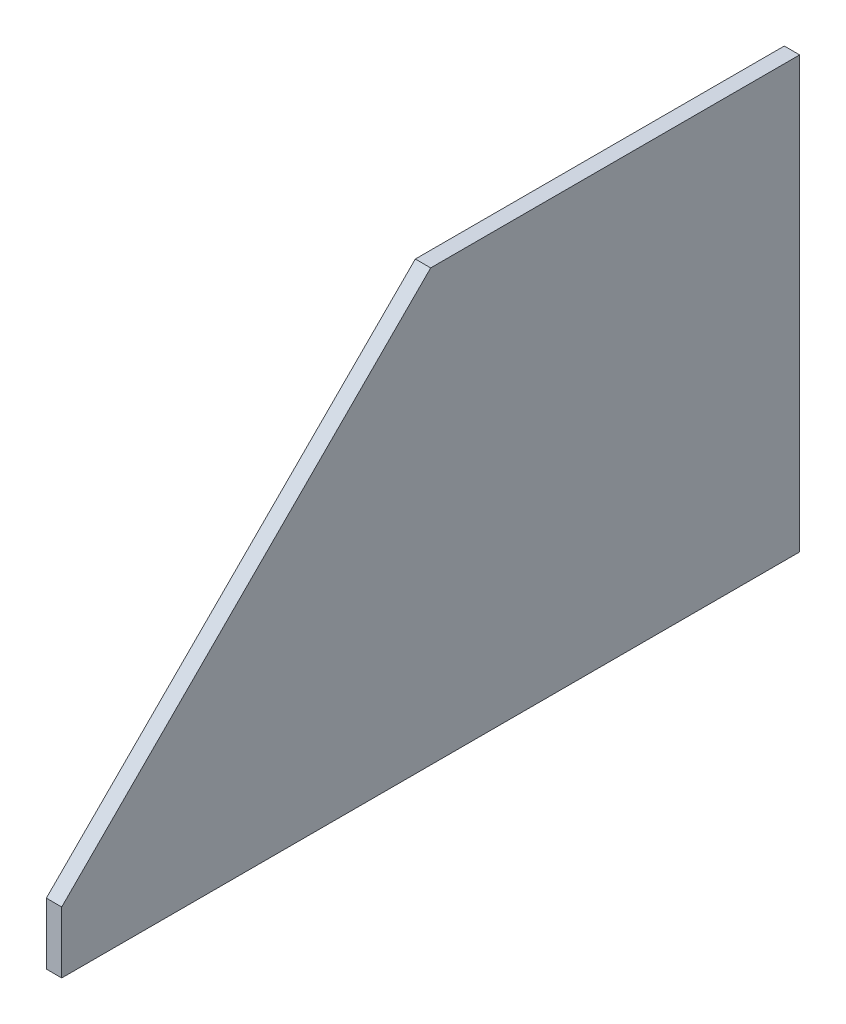
ISO-10303-21;
HEADER;
FILE_DESCRIPTION(('STEP AP214'),'2;1');
FILE_NAME('part.step','',(''),(''),'','','');
FILE_SCHEMA(('AUTOMOTIVE_DESIGN { 1 0 10303 214 1 1 1 1 }'));
ENDSEC;
DATA;
#1=APPLICATION_CONTEXT('core data for automotive mechanical design processes');
#2=APPLICATION_PROTOCOL_DEFINITION('international standard','automotive_design',2000,#1);
#3=PRODUCT_CONTEXT('',#1,'mechanical');
#4=PRODUCT('Part','Part','',(#3));
#5=PRODUCT_RELATED_PRODUCT_CATEGORY('part','',(#4));
#6=PRODUCT_DEFINITION_FORMATION('','',#4);
#7=PRODUCT_DEFINITION_CONTEXT('part definition',#1,'design');
#8=PRODUCT_DEFINITION('design','',#6,#7);
#9=PRODUCT_DEFINITION_SHAPE('','',#8);
#10=(LENGTH_UNIT() NAMED_UNIT(*) SI_UNIT(.MILLI.,.METRE.));
#11=(NAMED_UNIT(*) PLANE_ANGLE_UNIT() SI_UNIT($,.RADIAN.));
#12=(NAMED_UNIT(*) SI_UNIT($,.STERADIAN.) SOLID_ANGLE_UNIT());
#13=UNCERTAINTY_MEASURE_WITH_UNIT(LENGTH_MEASURE(1.E-05),#10,'distance_accuracy_value','');
#14=(GEOMETRIC_REPRESENTATION_CONTEXT(3) GLOBAL_UNCERTAINTY_ASSIGNED_CONTEXT((#13)) GLOBAL_UNIT_ASSIGNED_CONTEXT((#10,
#11,#12)) REPRESENTATION_CONTEXT('',''));
#15=CARTESIAN_POINT('',(0.,0.,0.));
#16=DIRECTION('',(0.,0.,1.));
#17=DIRECTION('',(1.,0.,0.));
#18=AXIS2_PLACEMENT_3D('',#15,#16,#17);
#19=CARTESIAN_POINT('',(6.35,0.,0.));
#20=DIRECTION('',(0.,0.,-1.));
#21=DIRECTION('',(0.,1.,0.));
#22=AXIS2_PLACEMENT_3D('',#19,#20,#21);
#23=PLANE('',#22);
#24=DIRECTION('',(0.,-1.,0.));
#25=VECTOR('',#24,1.);
#26=CARTESIAN_POINT('',(0.,0.,0.));
#27=LINE('',#26,#25);
#28=CARTESIAN_POINT('',(0.,152.4,0.));
#29=VERTEX_POINT('',#28);
#30=CARTESIAN_POINT('',(0.,-25.4,0.));
#31=VERTEX_POINT('',#30);
#32=EDGE_CURVE('E108',#29,#31,#27,.T.);
#33=ORIENTED_EDGE('',*,*,#32,.F.);
#34=DIRECTION('',(-1.,0.,0.));
#35=VECTOR('',#34,1.);
#36=CARTESIAN_POINT('',(6.35,152.4,0.));
#37=LINE('',#36,#35);
#38=CARTESIAN_POINT('',(6.35,152.4,0.));
#39=VERTEX_POINT('',#38);
#40=EDGE_CURVE('E11',#39,#29,#37,.T.);
#41=ORIENTED_EDGE('',*,*,#40,.F.);
#42=DIRECTION('',(0.,-1.,0.));
#43=VECTOR('',#42,1.);
#44=CARTESIAN_POINT('',(6.35,0.,0.));
#45=LINE('',#44,#43);
#46=CARTESIAN_POINT('',(6.35,-25.4,0.));
#47=VERTEX_POINT('',#46);
#48=EDGE_CURVE('E119',#39,#47,#45,.T.);
#49=ORIENTED_EDGE('',*,*,#48,.T.);
#50=DIRECTION('',(-1.,0.,0.));
#51=VECTOR('',#50,1.);
#52=CARTESIAN_POINT('',(6.35,-25.4,0.));
#53=LINE('',#52,#51);
#54=EDGE_CURVE('E51',#47,#31,#53,.T.);
#55=ORIENTED_EDGE('',*,*,#54,.T.);
#56=EDGE_LOOP('',(#33,#41,#49,#55));
#57=FACE_BOUND('',#56,.T.);
#58=ADVANCED_FACE('F35',(#57),#23,.T.);
#59=CARTESIAN_POINT('',(6.35,152.4,0.));
#60=DIRECTION('',(0.,1.,0.));
#61=DIRECTION('',(0.,0.,1.));
#62=AXIS2_PLACEMENT_3D('',#59,#60,#61);
#63=PLANE('',#62);
#64=DIRECTION('',(0.,0.,-1.));
#65=VECTOR('',#64,1.);
#66=CARTESIAN_POINT('',(0.,152.4,0.));
#67=LINE('',#66,#65);
#68=CARTESIAN_POINT('',(0.,152.4,152.4));
#69=VERTEX_POINT('',#68);
#70=EDGE_CURVE('E110',#69,#29,#67,.T.);
#71=ORIENTED_EDGE('',*,*,#70,.F.);
#72=DIRECTION('',(-1.,0.,0.));
#73=VECTOR('',#72,1.);
#74=CARTESIAN_POINT('',(6.35,152.4,152.4));
#75=LINE('',#74,#73);
#76=CARTESIAN_POINT('',(6.35,152.4,152.4));
#77=VERTEX_POINT('',#76);
#78=EDGE_CURVE('E43',#77,#69,#75,.T.);
#79=ORIENTED_EDGE('',*,*,#78,.F.);
#80=DIRECTION('',(0.,0.,-1.));
#81=VECTOR('',#80,1.);
#82=CARTESIAN_POINT('',(6.35,152.4,0.));
#83=LINE('',#82,#81);
#84=EDGE_CURVE('E100',#77,#39,#83,.T.);
#85=ORIENTED_EDGE('',*,*,#84,.T.);
#86=ORIENTED_EDGE('',*,*,#40,.T.);
#87=EDGE_LOOP('',(#71,#79,#85,#86));
#88=FACE_BOUND('',#87,.T.);
#89=ADVANCED_FACE('F123',(#88),#63,.T.);
#90=CARTESIAN_POINT('',(6.35,152.4,152.4));
#91=DIRECTION('',(0.,0.707106781186547,0.707106781186548));
#92=DIRECTION('',(0.,-0.707106781186548,0.707106781186547));
#93=AXIS2_PLACEMENT_3D('',#90,#91,#92);
#94=PLANE('',#93);
#95=DIRECTION('',(0.,0.707106781186548,-0.707106781186547));
#96=VECTOR('',#95,1.);
#97=CARTESIAN_POINT('',(0.,152.4,152.4));
#98=LINE('',#97,#96);
#99=CARTESIAN_POINT('',(0.,0.,304.8));
#100=VERTEX_POINT('',#99);
#101=EDGE_CURVE('E88',#100,#69,#98,.T.);
#102=ORIENTED_EDGE('',*,*,#101,.F.);
#103=DIRECTION('',(-1.,0.,0.));
#104=VECTOR('',#103,1.);
#105=CARTESIAN_POINT('',(6.35,0.,304.8));
#106=LINE('',#105,#104);
#107=CARTESIAN_POINT('',(6.35,0.,304.8));
#108=VERTEX_POINT('',#107);
#109=EDGE_CURVE('E83',#108,#100,#106,.T.);
#110=ORIENTED_EDGE('',*,*,#109,.F.);
#111=DIRECTION('',(0.,0.707106781186548,-0.707106781186547));
#112=VECTOR('',#111,1.);
#113=CARTESIAN_POINT('',(6.35,152.4,152.4));
#114=LINE('',#113,#112);
#115=EDGE_CURVE('E86',#108,#77,#114,.T.);
#116=ORIENTED_EDGE('',*,*,#115,.T.);
#117=ORIENTED_EDGE('',*,*,#78,.T.);
#118=EDGE_LOOP('',(#102,#110,#116,#117));
#119=FACE_BOUND('',#118,.T.);
#120=ADVANCED_FACE('F85',(#119),#94,.T.);
#121=CARTESIAN_POINT('',(6.35,0.,304.8));
#122=DIRECTION('',(0.,0.,1.));
#123=DIRECTION('',(1.,0.,0.));
#124=AXIS2_PLACEMENT_3D('',#121,#122,#123);
#125=PLANE('',#124);
#126=DIRECTION('',(0.,1.,0.));
#127=VECTOR('',#126,1.);
#128=CARTESIAN_POINT('',(0.,0.,304.8));
#129=LINE('',#128,#127);
#130=CARTESIAN_POINT('',(0.,-25.4,304.8));
#131=VERTEX_POINT('',#130);
#132=EDGE_CURVE('E114',#131,#100,#129,.T.);
#133=ORIENTED_EDGE('',*,*,#132,.F.);
#134=DIRECTION('',(-1.,0.,0.));
#135=VECTOR('',#134,1.);
#136=CARTESIAN_POINT('',(6.35,-25.4,304.8));
#137=LINE('',#136,#135);
#138=CARTESIAN_POINT('',(6.35,-25.4,304.8));
#139=VERTEX_POINT('',#138);
#140=EDGE_CURVE('E67',#139,#131,#137,.T.);
#141=ORIENTED_EDGE('',*,*,#140,.F.);
#142=DIRECTION('',(0.,1.,0.));
#143=VECTOR('',#142,1.);
#144=CARTESIAN_POINT('',(6.35,0.,304.8));
#145=LINE('',#144,#143);
#146=EDGE_CURVE('E98',#139,#108,#145,.T.);
#147=ORIENTED_EDGE('',*,*,#146,.T.);
#148=ORIENTED_EDGE('',*,*,#109,.T.);
#149=EDGE_LOOP('',(#133,#141,#147,#148));
#150=FACE_BOUND('',#149,.T.);
#151=ADVANCED_FACE('F102',(#150),#125,.T.);
#152=CARTESIAN_POINT('',(6.35,-25.4,0.));
#153=DIRECTION('',(0.,-1.,0.));
#154=DIRECTION('',(0.,0.,-1.));
#155=AXIS2_PLACEMENT_3D('',#152,#153,#154);
#156=PLANE('',#155);
#157=DIRECTION('',(0.,0.,1.));
#158=VECTOR('',#157,1.);
#159=CARTESIAN_POINT('',(0.,-25.4,0.));
#160=LINE('',#159,#158);
#161=EDGE_CURVE('E116',#31,#131,#160,.T.);
#162=ORIENTED_EDGE('',*,*,#161,.F.);
#163=ORIENTED_EDGE('',*,*,#54,.F.);
#164=DIRECTION('',(0.,0.,1.));
#165=VECTOR('',#164,1.);
#166=CARTESIAN_POINT('',(6.35,-25.4,0.));
#167=LINE('',#166,#165);
#168=EDGE_CURVE('E103',#47,#139,#167,.T.);
#169=ORIENTED_EDGE('',*,*,#168,.T.);
#170=ORIENTED_EDGE('',*,*,#140,.T.);
#171=EDGE_LOOP('',(#162,#163,#169,#170));
#172=FACE_BOUND('',#171,.T.);
#173=ADVANCED_FACE('F126',(#172),#156,.T.);
#174=CARTESIAN_POINT('',(6.35,0.,0.));
#175=DIRECTION('',(1.,0.,0.));
#176=DIRECTION('',(0.,0.,-1.));
#177=AXIS2_PLACEMENT_3D('',#174,#175,#176);
#178=PLANE('',#177);
#179=ORIENTED_EDGE('',*,*,#48,.F.);
#180=ORIENTED_EDGE('',*,*,#84,.F.);
#181=ORIENTED_EDGE('',*,*,#115,.F.);
#182=ORIENTED_EDGE('',*,*,#146,.F.);
#183=ORIENTED_EDGE('',*,*,#168,.F.);
#184=EDGE_LOOP('',(#179,#180,#181,#182,#183));
#185=FACE_BOUND('',#184,.T.);
#186=ADVANCED_FACE('F96',(#185),#178,.T.);
#187=CARTESIAN_POINT('',(0.,0.,0.));
#188=DIRECTION('',(1.,0.,0.));
#189=DIRECTION('',(0.,0.,-1.));
#190=AXIS2_PLACEMENT_3D('',#187,#188,#189);
#191=PLANE('',#190);
#192=ORIENTED_EDGE('',*,*,#32,.T.);
#193=ORIENTED_EDGE('',*,*,#161,.T.);
#194=ORIENTED_EDGE('',*,*,#132,.T.);
#195=ORIENTED_EDGE('',*,*,#101,.T.);
#196=ORIENTED_EDGE('',*,*,#70,.T.);
#197=EDGE_LOOP('',(#192,#193,#194,#195,#196));
#198=FACE_BOUND('',#197,.T.);
#199=ADVANCED_FACE('F125',(#198),#191,.F.);
#200=CLOSED_SHELL('',(#58,#89,#120,#151,#173,#186,#199));
#201=MANIFOLD_SOLID_BREP('B2',#200);
#202=ADVANCED_BREP_SHAPE_REPRESENTATION('',(#18,#201),#14);
#203=SHAPE_DEFINITION_REPRESENTATION(#9,#202);
ENDSEC;
END-ISO-10303-21;
